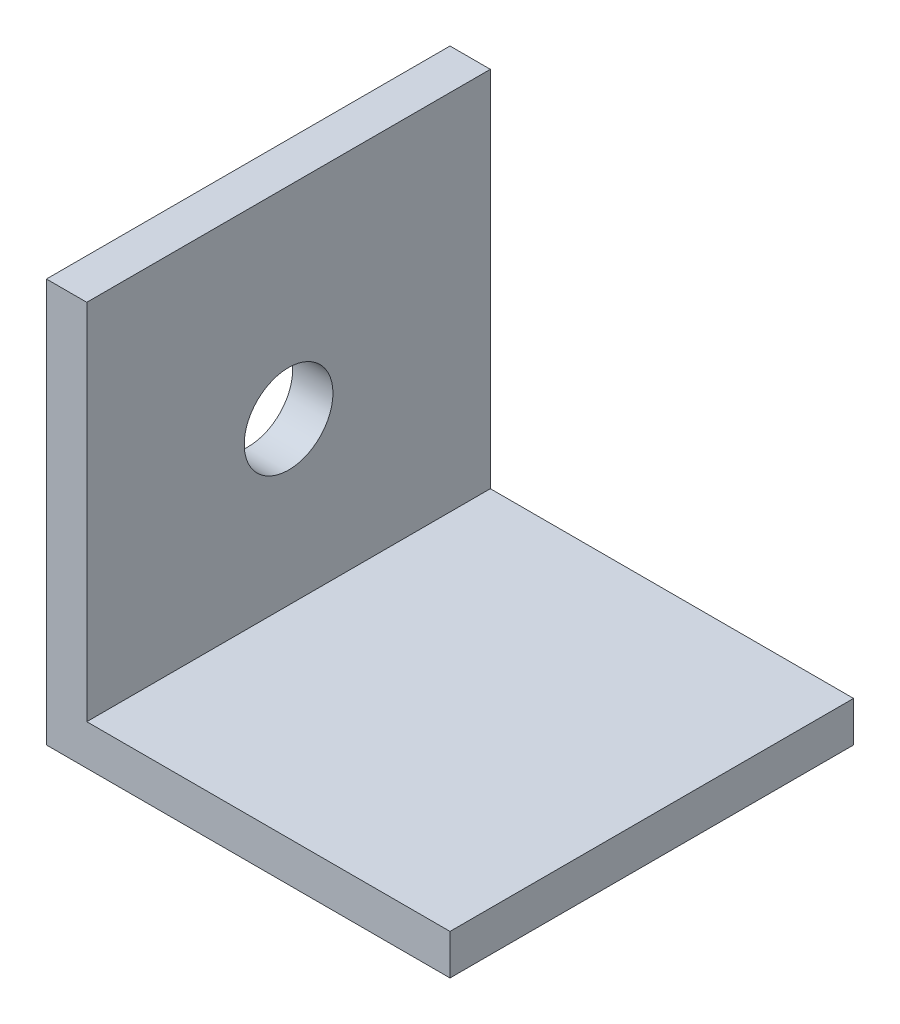
ISO-10303-21;
HEADER;
FILE_DESCRIPTION(('STEP AP214'),'2;1');
FILE_NAME('part.step','',(''),(''),'','','');
FILE_SCHEMA(('AUTOMOTIVE_DESIGN { 1 0 10303 214 1 1 1 1 }'));
ENDSEC;
DATA;
#1=APPLICATION_CONTEXT('core data for automotive mechanical design processes');
#2=APPLICATION_PROTOCOL_DEFINITION('international standard','automotive_design',2000,#1);
#3=PRODUCT_CONTEXT('',#1,'mechanical');
#4=PRODUCT('Part','Part','',(#3));
#5=PRODUCT_RELATED_PRODUCT_CATEGORY('part','',(#4));
#6=PRODUCT_DEFINITION_FORMATION('','',#4);
#7=PRODUCT_DEFINITION_CONTEXT('part definition',#1,'design');
#8=PRODUCT_DEFINITION('design','',#6,#7);
#9=PRODUCT_DEFINITION_SHAPE('','',#8);
#10=(LENGTH_UNIT() NAMED_UNIT(*) SI_UNIT(.MILLI.,.METRE.));
#11=(NAMED_UNIT(*) PLANE_ANGLE_UNIT() SI_UNIT($,.RADIAN.));
#12=(NAMED_UNIT(*) SI_UNIT($,.STERADIAN.) SOLID_ANGLE_UNIT());
#13=UNCERTAINTY_MEASURE_WITH_UNIT(LENGTH_MEASURE(1.E-05),#10,'distance_accuracy_value','');
#14=(GEOMETRIC_REPRESENTATION_CONTEXT(3) GLOBAL_UNCERTAINTY_ASSIGNED_CONTEXT((#13)) GLOBAL_UNIT_ASSIGNED_CONTEXT((#10,
#11,#12)) REPRESENTATION_CONTEXT('',''));
#15=CARTESIAN_POINT('',(0.,0.,0.));
#16=DIRECTION('',(0.,0.,1.));
#17=DIRECTION('',(1.,0.,0.));
#18=AXIS2_PLACEMENT_3D('',#15,#16,#17);
#19=CARTESIAN_POINT('',(0.,0.,25.));
#20=DIRECTION('',(0.,1.,0.));
#21=DIRECTION('',(0.,0.,1.));
#22=AXIS2_PLACEMENT_3D('',#19,#20,#21);
#23=PLANE('',#22);
#24=DIRECTION('',(1.,0.,0.));
#25=VECTOR('',#24,1.);
#26=CARTESIAN_POINT('',(0.,0.,-25.));
#27=LINE('',#26,#25);
#28=CARTESIAN_POINT('',(0.,0.,-25.));
#29=VERTEX_POINT('',#28);
#30=CARTESIAN_POINT('',(50.,0.,-25.));
#31=VERTEX_POINT('',#30);
#32=EDGE_CURVE('E116',#29,#31,#27,.T.);
#33=ORIENTED_EDGE('',*,*,#32,.T.);
#34=DIRECTION('',(0.,0.,-1.));
#35=VECTOR('',#34,1.);
#36=CARTESIAN_POINT('',(50.,0.,25.));
#37=LINE('',#36,#35);
#38=CARTESIAN_POINT('',(50.,0.,25.));
#39=VERTEX_POINT('',#38);
#40=EDGE_CURVE('E11',#39,#31,#37,.T.);
#41=ORIENTED_EDGE('',*,*,#40,.F.);
#42=DIRECTION('',(1.,0.,0.));
#43=VECTOR('',#42,1.);
#44=CARTESIAN_POINT('',(0.,0.,25.));
#45=LINE('',#44,#43);
#46=CARTESIAN_POINT('',(0.,0.,25.));
#47=VERTEX_POINT('',#46);
#48=EDGE_CURVE('E81',#47,#39,#45,.T.);
#49=ORIENTED_EDGE('',*,*,#48,.F.);
#50=DIRECTION('',(0.,0.,-1.));
#51=VECTOR('',#50,1.);
#52=CARTESIAN_POINT('',(0.,0.,25.));
#53=LINE('',#52,#51);
#54=EDGE_CURVE('E112',#47,#29,#53,.T.);
#55=ORIENTED_EDGE('',*,*,#54,.T.);
#56=EDGE_LOOP('',(#33,#41,#49,#55));
#57=FACE_BOUND('',#56,.T.);
#58=ADVANCED_FACE('F35',(#57),#23,.F.);
#59=CARTESIAN_POINT('',(50.,5.,25.));
#60=DIRECTION('',(1.,0.,0.));
#61=DIRECTION('',(0.,0.,-1.));
#62=AXIS2_PLACEMENT_3D('',#59,#60,#61);
#63=PLANE('',#62);
#64=DIRECTION('',(0.,-1.,0.));
#65=VECTOR('',#64,1.);
#66=CARTESIAN_POINT('',(50.,5.,-25.));
#67=LINE('',#66,#65);
#68=CARTESIAN_POINT('',(50.,5.,-25.));
#69=VERTEX_POINT('',#68);
#70=EDGE_CURVE('E119',#69,#31,#67,.T.);
#71=ORIENTED_EDGE('',*,*,#70,.F.);
#72=DIRECTION('',(0.,0.,-1.));
#73=VECTOR('',#72,1.);
#74=CARTESIAN_POINT('',(50.,5.,25.));
#75=LINE('',#74,#73);
#76=CARTESIAN_POINT('',(50.,5.,25.));
#77=VERTEX_POINT('',#76);
#78=EDGE_CURVE('E43',#77,#69,#75,.T.);
#79=ORIENTED_EDGE('',*,*,#78,.F.);
#80=DIRECTION('',(0.,-1.,0.));
#81=VECTOR('',#80,1.);
#82=CARTESIAN_POINT('',(50.,5.,25.));
#83=LINE('',#82,#81);
#84=EDGE_CURVE('E178',#77,#39,#83,.T.);
#85=ORIENTED_EDGE('',*,*,#84,.T.);
#86=ORIENTED_EDGE('',*,*,#40,.T.);
#87=EDGE_LOOP('',(#71,#79,#85,#86));
#88=FACE_BOUND('',#87,.T.);
#89=ADVANCED_FACE('F138',(#88),#63,.T.);
#90=CARTESIAN_POINT('',(0.,5.,25.));
#91=DIRECTION('',(0.,1.,0.));
#92=DIRECTION('',(0.,0.,1.));
#93=AXIS2_PLACEMENT_3D('',#90,#91,#92);
#94=PLANE('',#93);
#95=DIRECTION('',(1.,0.,0.));
#96=VECTOR('',#95,1.);
#97=CARTESIAN_POINT('',(0.,5.,-25.));
#98=LINE('',#97,#96);
#99=CARTESIAN_POINT('',(5.,5.,-25.));
#100=VERTEX_POINT('',#99);
#101=EDGE_CURVE('E123',#100,#69,#98,.T.);
#102=ORIENTED_EDGE('',*,*,#101,.F.);
#103=DIRECTION('',(0.,0.,-1.));
#104=VECTOR('',#103,1.);
#105=CARTESIAN_POINT('',(5.,5.,25.));
#106=LINE('',#105,#104);
#107=CARTESIAN_POINT('',(5.,5.,25.));
#108=VERTEX_POINT('',#107);
#109=EDGE_CURVE('E102',#108,#100,#106,.T.);
#110=ORIENTED_EDGE('',*,*,#109,.F.);
#111=DIRECTION('',(1.,0.,0.));
#112=VECTOR('',#111,1.);
#113=CARTESIAN_POINT('',(0.,5.,25.));
#114=LINE('',#113,#112);
#115=EDGE_CURVE('E108',#108,#77,#114,.T.);
#116=ORIENTED_EDGE('',*,*,#115,.T.);
#117=ORIENTED_EDGE('',*,*,#78,.T.);
#118=EDGE_LOOP('',(#102,#110,#116,#117));
#119=FACE_BOUND('',#118,.T.);
#120=ADVANCED_FACE('F135',(#119),#94,.T.);
#121=CARTESIAN_POINT('',(5.,0.,25.));
#122=DIRECTION('',(1.,0.,0.));
#123=DIRECTION('',(0.,0.,-1.));
#124=AXIS2_PLACEMENT_3D('',#121,#122,#123);
#125=PLANE('',#124);
#126=CARTESIAN_POINT('',(5.,25.,0.));
#127=DIRECTION('',(1.,0.,0.));
#128=DIRECTION('',(0.,0.,-1.));
#129=AXIS2_PLACEMENT_3D('',#126,#127,#128);
#130=CIRCLE('',#129,5.5);
#131=CARTESIAN_POINT('',(5.,25.,-5.5));
#132=VERTEX_POINT('',#131);
#133=EDGE_CURVE('E120',#132,#132,#130,.T.);
#134=ORIENTED_EDGE('',*,*,#133,.F.);
#135=EDGE_LOOP('',(#134));
#136=FACE_BOUND('',#135,.T.);
#137=DIRECTION('',(0.,1.,0.));
#138=VECTOR('',#137,1.);
#139=CARTESIAN_POINT('',(5.,0.,-25.));
#140=LINE('',#139,#138);
#141=CARTESIAN_POINT('',(5.,50.,-25.));
#142=VERTEX_POINT('',#141);
#143=EDGE_CURVE('E97',#142,#100,#140,.F.);
#144=ORIENTED_EDGE('',*,*,#143,.F.);
#145=DIRECTION('',(0.,0.,-1.));
#146=VECTOR('',#145,1.);
#147=CARTESIAN_POINT('',(5.,50.,25.));
#148=LINE('',#147,#146);
#149=CARTESIAN_POINT('',(5.,50.,25.));
#150=VERTEX_POINT('',#149);
#151=EDGE_CURVE('E92',#150,#142,#148,.T.);
#152=ORIENTED_EDGE('',*,*,#151,.F.);
#153=DIRECTION('',(0.,1.,0.));
#154=VECTOR('',#153,1.);
#155=CARTESIAN_POINT('',(5.,0.,25.));
#156=LINE('',#155,#154);
#157=EDGE_CURVE('E95',#150,#108,#156,.F.);
#158=ORIENTED_EDGE('',*,*,#157,.T.);
#159=ORIENTED_EDGE('',*,*,#109,.T.);
#160=EDGE_LOOP('',(#144,#152,#158,#159));
#161=FACE_BOUND('',#160,.T.);
#162=ADVANCED_FACE('F94',(#136,#161),#125,.T.);
#163=CARTESIAN_POINT('',(0.,50.,25.));
#164=DIRECTION('',(0.,1.,0.));
#165=DIRECTION('',(0.,0.,1.));
#166=AXIS2_PLACEMENT_3D('',#163,#164,#165);
#167=PLANE('',#166);
#168=DIRECTION('',(1.,0.,0.));
#169=VECTOR('',#168,1.);
#170=CARTESIAN_POINT('',(0.,50.,-25.));
#171=LINE('',#170,#169);
#172=CARTESIAN_POINT('',(0.,50.,-25.));
#173=VERTEX_POINT('',#172);
#174=EDGE_CURVE('E127',#173,#142,#171,.T.);
#175=ORIENTED_EDGE('',*,*,#174,.F.);
#176=DIRECTION('',(0.,0.,-1.));
#177=VECTOR('',#176,1.);
#178=CARTESIAN_POINT('',(0.,50.,25.));
#179=LINE('',#178,#177);
#180=CARTESIAN_POINT('',(0.,50.,25.));
#181=VERTEX_POINT('',#180);
#182=EDGE_CURVE('E72',#181,#173,#179,.T.);
#183=ORIENTED_EDGE('',*,*,#182,.F.);
#184=DIRECTION('',(1.,0.,0.));
#185=VECTOR('',#184,1.);
#186=CARTESIAN_POINT('',(0.,50.,25.));
#187=LINE('',#186,#185);
#188=EDGE_CURVE('E106',#181,#150,#187,.T.);
#189=ORIENTED_EDGE('',*,*,#188,.T.);
#190=ORIENTED_EDGE('',*,*,#151,.T.);
#191=EDGE_LOOP('',(#175,#183,#189,#190));
#192=FACE_BOUND('',#191,.T.);
#193=ADVANCED_FACE('F110',(#192),#167,.T.);
#194=CARTESIAN_POINT('',(0.,0.,25.));
#195=DIRECTION('',(1.,0.,0.));
#196=DIRECTION('',(0.,0.,-1.));
#197=AXIS2_PLACEMENT_3D('',#194,#195,#196);
#198=PLANE('',#197);
#199=CARTESIAN_POINT('',(0.,25.,0.));
#200=DIRECTION('',(1.,0.,0.));
#201=DIRECTION('',(0.,0.,-1.));
#202=AXIS2_PLACEMENT_3D('',#199,#200,#201);
#203=CIRCLE('',#202,5.5);
#204=CARTESIAN_POINT('',(0.,25.,-5.5));
#205=VERTEX_POINT('',#204);
#206=EDGE_CURVE('E173',#205,#205,#203,.T.);
#207=ORIENTED_EDGE('',*,*,#206,.T.);
#208=EDGE_LOOP('',(#207));
#209=FACE_BOUND('',#208,.T.);
#210=DIRECTION('',(0.,-1.,0.));
#211=VECTOR('',#210,1.);
#212=CARTESIAN_POINT('',(0.,0.,-25.));
#213=LINE('',#212,#211);
#214=EDGE_CURVE('E75',#173,#29,#213,.T.);
#215=ORIENTED_EDGE('',*,*,#214,.T.);
#216=ORIENTED_EDGE('',*,*,#54,.F.);
#217=DIRECTION('',(0.,-1.,0.));
#218=VECTOR('',#217,1.);
#219=CARTESIAN_POINT('',(0.,0.,25.));
#220=LINE('',#219,#218);
#221=EDGE_CURVE('E51',#181,#47,#220,.T.);
#222=ORIENTED_EDGE('',*,*,#221,.F.);
#223=ORIENTED_EDGE('',*,*,#182,.T.);
#224=EDGE_LOOP('',(#215,#216,#222,#223));
#225=FACE_BOUND('',#224,.T.);
#226=ADVANCED_FACE('F143',(#209,#225),#198,.F.);
#227=CARTESIAN_POINT('',(0.,0.,25.));
#228=DIRECTION('',(0.,0.,-1.));
#229=DIRECTION('',(-1.,0.,0.));
#230=AXIS2_PLACEMENT_3D('',#227,#228,#229);
#231=PLANE('',#230);
#232=ORIENTED_EDGE('',*,*,#48,.T.);
#233=ORIENTED_EDGE('',*,*,#84,.F.);
#234=ORIENTED_EDGE('',*,*,#115,.F.);
#235=ORIENTED_EDGE('',*,*,#157,.F.);
#236=ORIENTED_EDGE('',*,*,#188,.F.);
#237=ORIENTED_EDGE('',*,*,#221,.T.);
#238=EDGE_LOOP('',(#232,#233,#234,#235,#236,#237));
#239=FACE_BOUND('',#238,.T.);
#240=ADVANCED_FACE('F105',(#239),#231,.F.);
#241=CARTESIAN_POINT('',(0.,0.,-25.));
#242=DIRECTION('',(0.,0.,-1.));
#243=DIRECTION('',(-1.,0.,0.));
#244=AXIS2_PLACEMENT_3D('',#241,#242,#243);
#245=PLANE('',#244);
#246=ORIENTED_EDGE('',*,*,#32,.F.);
#247=ORIENTED_EDGE('',*,*,#214,.F.);
#248=ORIENTED_EDGE('',*,*,#174,.T.);
#249=ORIENTED_EDGE('',*,*,#143,.T.);
#250=ORIENTED_EDGE('',*,*,#101,.T.);
#251=ORIENTED_EDGE('',*,*,#70,.T.);
#252=EDGE_LOOP('',(#246,#247,#248,#249,#250,#251));
#253=FACE_BOUND('',#252,.T.);
#254=ADVANCED_FACE('F141',(#253),#245,.T.);
#255=CARTESIAN_POINT('',(5.,25.,0.));
#256=DIRECTION('',(-1.,0.,0.));
#257=DIRECTION('',(0.,0.,1.));
#258=AXIS2_PLACEMENT_3D('',#255,#256,#257);
#259=CYLINDRICAL_SURFACE('',#258,5.5);
#260=ORIENTED_EDGE('',*,*,#133,.T.);
#261=EDGE_LOOP('',(#260));
#262=FACE_BOUND('',#261,.T.);
#263=ORIENTED_EDGE('',*,*,#206,.F.);
#264=EDGE_LOOP('',(#263));
#265=FACE_BOUND('',#264,.T.);
#266=ADVANCED_FACE('F181',(#262,#265),#259,.F.);
#267=CLOSED_SHELL('',(#58,#89,#120,#162,#193,#226,#240,#254,#266));
#268=MANIFOLD_SOLID_BREP('B2',#267);
#269=ADVANCED_BREP_SHAPE_REPRESENTATION('',(#18,#268),#14);
#270=SHAPE_DEFINITION_REPRESENTATION(#9,#269);
ENDSEC;
END-ISO-10303-21;
